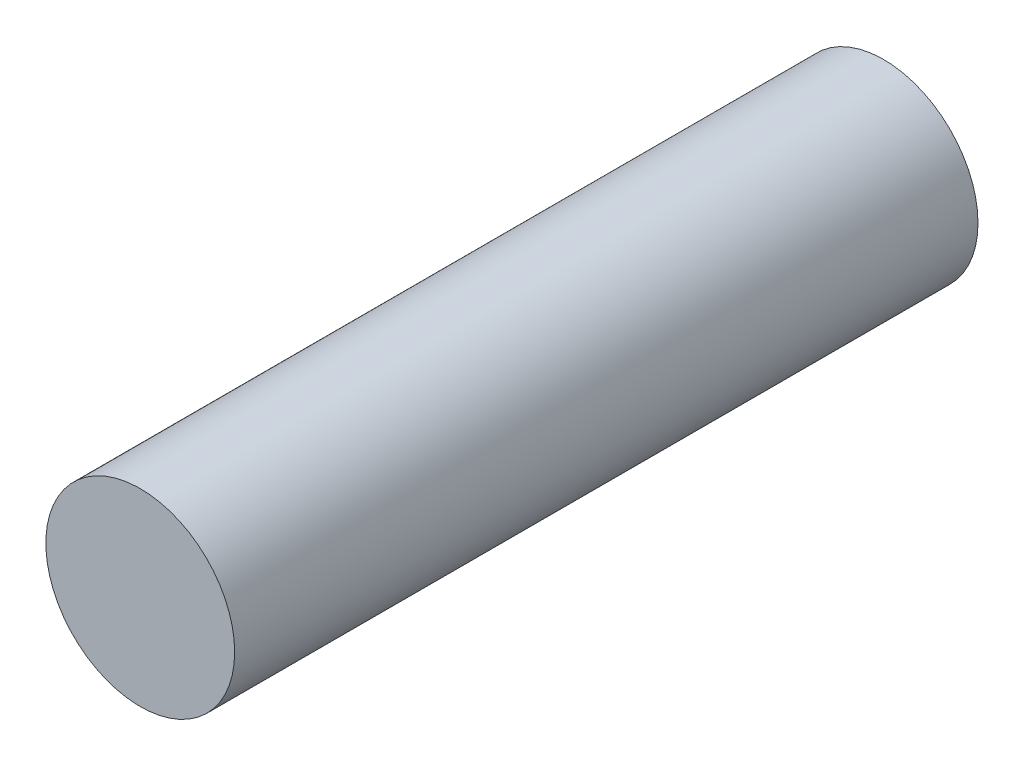
ISO-10303-21;
HEADER;
FILE_DESCRIPTION(('STEP AP214'),'2;1');
FILE_NAME('part.step','',(''),(''),'','','');
FILE_SCHEMA(('AUTOMOTIVE_DESIGN { 1 0 10303 214 1 1 1 1 }'));
ENDSEC;
DATA;
#1=APPLICATION_CONTEXT('core data for automotive mechanical design processes');
#2=APPLICATION_PROTOCOL_DEFINITION('international standard','automotive_design',2000,#1);
#3=PRODUCT_CONTEXT('',#1,'mechanical');
#4=PRODUCT('Part','Part','',(#3));
#5=PRODUCT_RELATED_PRODUCT_CATEGORY('part','',(#4));
#6=PRODUCT_DEFINITION_FORMATION('','',#4);
#7=PRODUCT_DEFINITION_CONTEXT('part definition',#1,'design');
#8=PRODUCT_DEFINITION('design','',#6,#7);
#9=PRODUCT_DEFINITION_SHAPE('','',#8);
#10=(LENGTH_UNIT() NAMED_UNIT(*) SI_UNIT(.MILLI.,.METRE.));
#11=(NAMED_UNIT(*) PLANE_ANGLE_UNIT() SI_UNIT($,.RADIAN.));
#12=(NAMED_UNIT(*) SI_UNIT($,.STERADIAN.) SOLID_ANGLE_UNIT());
#13=UNCERTAINTY_MEASURE_WITH_UNIT(LENGTH_MEASURE(1.E-05),#10,'distance_accuracy_value','');
#14=(GEOMETRIC_REPRESENTATION_CONTEXT(3) GLOBAL_UNCERTAINTY_ASSIGNED_CONTEXT((#13)) GLOBAL_UNIT_ASSIGNED_CONTEXT((#10,
#11,#12)) REPRESENTATION_CONTEXT('',''));
#15=CARTESIAN_POINT('',(0.,0.,0.));
#16=DIRECTION('',(0.,0.,1.));
#17=DIRECTION('',(1.,0.,0.));
#18=AXIS2_PLACEMENT_3D('',#15,#16,#17);
#19=CARTESIAN_POINT('',(0.,0.,25.));
#20=DIRECTION('',(0.,0.,-1.));
#21=DIRECTION('',(-1.,0.,0.));
#22=AXIS2_PLACEMENT_3D('',#19,#20,#21);
#23=CYLINDRICAL_SURFACE('',#22,6.35);
#24=CARTESIAN_POINT('',(0.,0.,25.));
#25=DIRECTION('',(0.,0.,1.));
#26=DIRECTION('',(1.,0.,0.));
#27=AXIS2_PLACEMENT_3D('',#24,#25,#26);
#28=CIRCLE('',#27,6.35);
#29=CARTESIAN_POINT('',(6.35,0.,25.));
#30=VERTEX_POINT('',#29);
#31=EDGE_CURVE('E10',#30,#30,#28,.T.);
#32=ORIENTED_EDGE('',*,*,#31,.F.);
#33=EDGE_LOOP('',(#32));
#34=FACE_BOUND('',#33,.T.);
#35=CARTESIAN_POINT('',(0.,0.,-25.));
#36=DIRECTION('',(0.,0.,1.));
#37=DIRECTION('',(1.,0.,0.));
#38=AXIS2_PLACEMENT_3D('',#35,#36,#37);
#39=CIRCLE('',#38,6.35);
#40=CARTESIAN_POINT('',(6.35,0.,-25.));
#41=VERTEX_POINT('',#40);
#42=EDGE_CURVE('E34',#41,#41,#39,.T.);
#43=ORIENTED_EDGE('',*,*,#42,.T.);
#44=EDGE_LOOP('',(#43));
#45=FACE_BOUND('',#44,.T.);
#46=ADVANCED_FACE('F31',(#34,#45),#23,.T.);
#47=CARTESIAN_POINT('',(0.,0.,25.));
#48=DIRECTION('',(0.,0.,1.));
#49=DIRECTION('',(1.,0.,0.));
#50=AXIS2_PLACEMENT_3D('',#47,#48,#49);
#51=PLANE('',#50);
#52=ORIENTED_EDGE('',*,*,#31,.T.);
#53=EDGE_LOOP('',(#52));
#54=FACE_BOUND('',#53,.T.);
#55=ADVANCED_FACE('F46',(#54),#51,.T.);
#56=CARTESIAN_POINT('',(0.,0.,-25.));
#57=DIRECTION('',(0.,0.,1.));
#58=DIRECTION('',(1.,0.,0.));
#59=AXIS2_PLACEMENT_3D('',#56,#57,#58);
#60=PLANE('',#59);
#61=ORIENTED_EDGE('',*,*,#42,.F.);
#62=EDGE_LOOP('',(#61));
#63=FACE_BOUND('',#62,.T.);
#64=ADVANCED_FACE('F44',(#63),#60,.F.);
#65=CLOSED_SHELL('',(#46,#55,#64));
#66=MANIFOLD_SOLID_BREP('B2',#65);
#67=ADVANCED_BREP_SHAPE_REPRESENTATION('',(#18,#66),#14);
#68=SHAPE_DEFINITION_REPRESENTATION(#9,#67);
ENDSEC;
END-ISO-10303-21;
